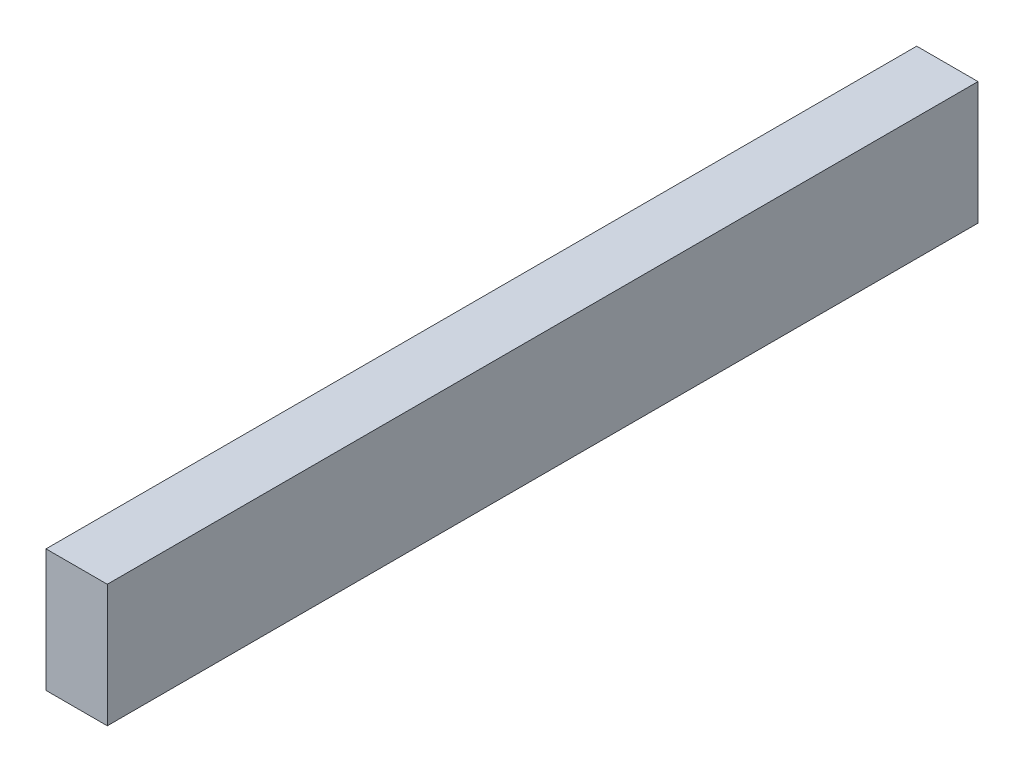
ISO-10303-21;
HEADER;
FILE_DESCRIPTION(('STEP AP214'),'2;1');
FILE_NAME('part.step','',(''),(''),'','','');
FILE_SCHEMA(('AUTOMOTIVE_DESIGN { 1 0 10303 214 1 1 1 1 }'));
ENDSEC;
DATA;
#1=APPLICATION_CONTEXT('core data for automotive mechanical design processes');
#2=APPLICATION_PROTOCOL_DEFINITION('international standard','automotive_design',2000,#1);
#3=PRODUCT_CONTEXT('',#1,'mechanical');
#4=PRODUCT('Part','Part','',(#3));
#5=PRODUCT_RELATED_PRODUCT_CATEGORY('part','',(#4));
#6=PRODUCT_DEFINITION_FORMATION('','',#4);
#7=PRODUCT_DEFINITION_CONTEXT('part definition',#1,'design');
#8=PRODUCT_DEFINITION('design','',#6,#7);
#9=PRODUCT_DEFINITION_SHAPE('','',#8);
#10=(LENGTH_UNIT() NAMED_UNIT(*) SI_UNIT(.MILLI.,.METRE.));
#11=(NAMED_UNIT(*) PLANE_ANGLE_UNIT() SI_UNIT($,.RADIAN.));
#12=(NAMED_UNIT(*) SI_UNIT($,.STERADIAN.) SOLID_ANGLE_UNIT());
#13=UNCERTAINTY_MEASURE_WITH_UNIT(LENGTH_MEASURE(1.E-05),#10,'distance_accuracy_value','');
#14=(GEOMETRIC_REPRESENTATION_CONTEXT(3) GLOBAL_UNCERTAINTY_ASSIGNED_CONTEXT((#13)) GLOBAL_UNIT_ASSIGNED_CONTEXT((#10,
#11,#12)) REPRESENTATION_CONTEXT('',''));
#15=CARTESIAN_POINT('',(0.,0.,0.));
#16=DIRECTION('',(0.,0.,1.));
#17=DIRECTION('',(1.,0.,0.));
#18=AXIS2_PLACEMENT_3D('',#15,#16,#17);
#19=CARTESIAN_POINT('',(0.,0.,721.45));
#20=DIRECTION('',(1.,0.,0.));
#21=DIRECTION('',(0.,0.,-1.));
#22=AXIS2_PLACEMENT_3D('',#19,#20,#21);
#23=PLANE('',#22);
#24=DIRECTION('',(0.,-1.,0.));
#25=VECTOR('',#24,1.);
#26=CARTESIAN_POINT('',(0.,0.,0.));
#27=LINE('',#26,#25);
#28=CARTESIAN_POINT('',(0.,101.6,0.));
#29=VERTEX_POINT('',#28);
#30=CARTESIAN_POINT('',(0.,0.,0.));
#31=VERTEX_POINT('',#30);
#32=EDGE_CURVE('E100',#29,#31,#27,.T.);
#33=ORIENTED_EDGE('',*,*,#32,.T.);
#34=DIRECTION('',(0.,0.,-1.));
#35=VECTOR('',#34,1.);
#36=CARTESIAN_POINT('',(0.,0.,721.45));
#37=LINE('',#36,#35);
#38=CARTESIAN_POINT('',(0.,0.,721.45));
#39=VERTEX_POINT('',#38);
#40=EDGE_CURVE('E11',#39,#31,#37,.T.);
#41=ORIENTED_EDGE('',*,*,#40,.F.);
#42=DIRECTION('',(0.,-1.,0.));
#43=VECTOR('',#42,1.);
#44=CARTESIAN_POINT('',(0.,0.,721.45));
#45=LINE('',#44,#43);
#46=CARTESIAN_POINT('',(0.,101.6,721.45));
#47=VERTEX_POINT('',#46);
#48=EDGE_CURVE('E88',#47,#39,#45,.T.);
#49=ORIENTED_EDGE('',*,*,#48,.F.);
#50=DIRECTION('',(0.,0.,-1.));
#51=VECTOR('',#50,1.);
#52=CARTESIAN_POINT('',(0.,101.6,721.45));
#53=LINE('',#52,#51);
#54=EDGE_CURVE('E96',#47,#29,#53,.T.);
#55=ORIENTED_EDGE('',*,*,#54,.T.);
#56=EDGE_LOOP('',(#33,#41,#49,#55));
#57=FACE_BOUND('',#56,.T.);
#58=ADVANCED_FACE('F37',(#57),#23,.F.);
#59=CARTESIAN_POINT('',(0.,0.,721.45));
#60=DIRECTION('',(0.,1.,0.));
#61=DIRECTION('',(0.,0.,1.));
#62=AXIS2_PLACEMENT_3D('',#59,#60,#61);
#63=PLANE('',#62);
#64=DIRECTION('',(1.,0.,0.));
#65=VECTOR('',#64,1.);
#66=CARTESIAN_POINT('',(0.,0.,0.));
#67=LINE('',#66,#65);
#68=CARTESIAN_POINT('',(50.8,0.,0.));
#69=VERTEX_POINT('',#68);
#70=EDGE_CURVE('E92',#31,#69,#67,.T.);
#71=ORIENTED_EDGE('',*,*,#70,.T.);
#72=DIRECTION('',(0.,0.,-1.));
#73=VECTOR('',#72,1.);
#74=CARTESIAN_POINT('',(50.8,0.,721.45));
#75=LINE('',#74,#73);
#76=CARTESIAN_POINT('',(50.8,0.,721.45));
#77=VERTEX_POINT('',#76);
#78=EDGE_CURVE('E45',#77,#69,#75,.T.);
#79=ORIENTED_EDGE('',*,*,#78,.F.);
#80=DIRECTION('',(1.,0.,0.));
#81=VECTOR('',#80,1.);
#82=CARTESIAN_POINT('',(0.,0.,721.45));
#83=LINE('',#82,#81);
#84=EDGE_CURVE('E83',#39,#77,#83,.T.);
#85=ORIENTED_EDGE('',*,*,#84,.F.);
#86=ORIENTED_EDGE('',*,*,#40,.T.);
#87=EDGE_LOOP('',(#71,#79,#85,#86));
#88=FACE_BOUND('',#87,.T.);
#89=ADVANCED_FACE('F91',(#88),#63,.F.);
#90=CARTESIAN_POINT('',(50.8,0.,721.45));
#91=DIRECTION('',(-1.,0.,0.));
#92=DIRECTION('',(0.,0.,1.));
#93=AXIS2_PLACEMENT_3D('',#90,#91,#92);
#94=PLANE('',#93);
#95=DIRECTION('',(0.,1.,0.));
#96=VECTOR('',#95,1.);
#97=CARTESIAN_POINT('',(50.8,0.,0.));
#98=LINE('',#97,#96);
#99=CARTESIAN_POINT('',(50.8,101.6,0.));
#100=VERTEX_POINT('',#99);
#101=EDGE_CURVE('E70',#69,#100,#98,.T.);
#102=ORIENTED_EDGE('',*,*,#101,.T.);
#103=DIRECTION('',(0.,0.,-1.));
#104=VECTOR('',#103,1.);
#105=CARTESIAN_POINT('',(50.8,101.6,721.45));
#106=LINE('',#105,#104);
#107=CARTESIAN_POINT('',(50.8,101.6,721.45));
#108=VERTEX_POINT('',#107);
#109=EDGE_CURVE('E93',#108,#100,#106,.T.);
#110=ORIENTED_EDGE('',*,*,#109,.F.);
#111=DIRECTION('',(0.,1.,0.));
#112=VECTOR('',#111,1.);
#113=CARTESIAN_POINT('',(50.8,0.,721.45));
#114=LINE('',#113,#112);
#115=EDGE_CURVE('E86',#77,#108,#114,.T.);
#116=ORIENTED_EDGE('',*,*,#115,.F.);
#117=ORIENTED_EDGE('',*,*,#78,.T.);
#118=EDGE_LOOP('',(#102,#110,#116,#117));
#119=FACE_BOUND('',#118,.T.);
#120=ADVANCED_FACE('F94',(#119),#94,.F.);
#121=CARTESIAN_POINT('',(0.,101.6,721.45));
#122=DIRECTION('',(0.,-1.,0.));
#123=DIRECTION('',(0.,0.,-1.));
#124=AXIS2_PLACEMENT_3D('',#121,#122,#123);
#125=PLANE('',#124);
#126=DIRECTION('',(-1.,0.,0.));
#127=VECTOR('',#126,1.);
#128=CARTESIAN_POINT('',(0.,101.6,0.));
#129=LINE('',#128,#127);
#130=EDGE_CURVE('E76',#100,#29,#129,.T.);
#131=ORIENTED_EDGE('',*,*,#130,.T.);
#132=ORIENTED_EDGE('',*,*,#54,.F.);
#133=DIRECTION('',(-1.,0.,0.));
#134=VECTOR('',#133,1.);
#135=CARTESIAN_POINT('',(0.,101.6,721.45));
#136=LINE('',#135,#134);
#137=EDGE_CURVE('E53',#108,#47,#136,.T.);
#138=ORIENTED_EDGE('',*,*,#137,.F.);
#139=ORIENTED_EDGE('',*,*,#109,.T.);
#140=EDGE_LOOP('',(#131,#132,#138,#139));
#141=FACE_BOUND('',#140,.T.);
#142=ADVANCED_FACE('F107',(#141),#125,.F.);
#143=CARTESIAN_POINT('',(0.,0.,721.45));
#144=DIRECTION('',(0.,0.,-1.));
#145=DIRECTION('',(-1.,0.,0.));
#146=AXIS2_PLACEMENT_3D('',#143,#144,#145);
#147=PLANE('',#146);
#148=ORIENTED_EDGE('',*,*,#48,.T.);
#149=ORIENTED_EDGE('',*,*,#84,.T.);
#150=ORIENTED_EDGE('',*,*,#115,.T.);
#151=ORIENTED_EDGE('',*,*,#137,.T.);
#152=EDGE_LOOP('',(#148,#149,#150,#151));
#153=FACE_BOUND('',#152,.T.);
#154=ADVANCED_FACE('F84',(#153),#147,.F.);
#155=CARTESIAN_POINT('',(0.,0.,0.));
#156=DIRECTION('',(0.,0.,-1.));
#157=DIRECTION('',(-1.,0.,0.));
#158=AXIS2_PLACEMENT_3D('',#155,#156,#157);
#159=PLANE('',#158);
#160=ORIENTED_EDGE('',*,*,#32,.F.);
#161=ORIENTED_EDGE('',*,*,#130,.F.);
#162=ORIENTED_EDGE('',*,*,#101,.F.);
#163=ORIENTED_EDGE('',*,*,#70,.F.);
#164=EDGE_LOOP('',(#160,#161,#162,#163));
#165=FACE_BOUND('',#164,.T.);
#166=ADVANCED_FACE('F110',(#165),#159,.T.);
#167=CLOSED_SHELL('',(#58,#89,#120,#142,#154,#166));
#168=MANIFOLD_SOLID_BREP('B2',#167);
#169=ADVANCED_BREP_SHAPE_REPRESENTATION('',(#18,#168),#14);
#170=SHAPE_DEFINITION_REPRESENTATION(#9,#169);
ENDSEC;
END-ISO-10303-21;
